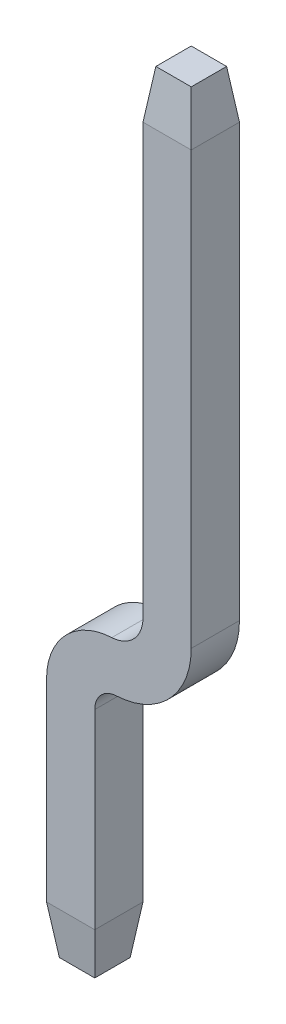
ISO-10303-21;
HEADER;
FILE_DESCRIPTION(('STEP AP214'),'2;1');
FILE_NAME('part.step','',(''),(''),'','','');
FILE_SCHEMA(('AUTOMOTIVE_DESIGN { 1 0 10303 214 1 1 1 1 }'));
ENDSEC;
DATA;
#1=APPLICATION_CONTEXT('core data for automotive mechanical design processes');
#2=APPLICATION_PROTOCOL_DEFINITION('international standard','automotive_design',2000,#1);
#3=PRODUCT_CONTEXT('',#1,'mechanical');
#4=PRODUCT('Part','Part','',(#3));
#5=PRODUCT_RELATED_PRODUCT_CATEGORY('part','',(#4));
#6=PRODUCT_DEFINITION_FORMATION('','',#4);
#7=PRODUCT_DEFINITION_CONTEXT('part definition',#1,'design');
#8=PRODUCT_DEFINITION('design','',#6,#7);
#9=PRODUCT_DEFINITION_SHAPE('','',#8);
#10=(LENGTH_UNIT() NAMED_UNIT(*) SI_UNIT(.MILLI.,.METRE.));
#11=(NAMED_UNIT(*) PLANE_ANGLE_UNIT() SI_UNIT($,.RADIAN.));
#12=(NAMED_UNIT(*) SI_UNIT($,.STERADIAN.) SOLID_ANGLE_UNIT());
#13=UNCERTAINTY_MEASURE_WITH_UNIT(LENGTH_MEASURE(1.E-05),#10,'distance_accuracy_value','');
#14=(GEOMETRIC_REPRESENTATION_CONTEXT(3) GLOBAL_UNCERTAINTY_ASSIGNED_CONTEXT((#13)) GLOBAL_UNIT_ASSIGNED_CONTEXT((#10,
#11,#12)) REPRESENTATION_CONTEXT('',''));
#15=CARTESIAN_POINT('',(0.,0.,0.));
#16=DIRECTION('',(0.,0.,1.));
#17=DIRECTION('',(1.,0.,0.));
#18=AXIS2_PLACEMENT_3D('',#15,#16,#17);
#19=CARTESIAN_POINT('',(0.,1.5,0.3));
#20=DIRECTION('',(1.,0.,0.));
#21=DIRECTION('',(0.,0.,-1.));
#22=AXIS2_PLACEMENT_3D('',#19,#20,#21);
#23=PLANE('',#22);
#24=DIRECTION('',(0.,-1.,0.));
#25=VECTOR('',#24,1.);
#26=CARTESIAN_POINT('',(0.,1.5,0.));
#27=LINE('',#26,#25);
#28=CARTESIAN_POINT('',(0.,1.5,0.));
#29=VERTEX_POINT('',#28);
#30=CARTESIAN_POINT('',(0.,0.3,0.));
#31=VERTEX_POINT('',#30);
#32=EDGE_CURVE('E10',#29,#31,#27,.T.);
#33=ORIENTED_EDGE('',*,*,#32,.T.);
#34=DIRECTION('',(0.,0.,-1.));
#35=VECTOR('',#34,1.);
#36=CARTESIAN_POINT('',(0.,0.3,0.3));
#37=LINE('',#36,#35);
#38=CARTESIAN_POINT('',(0.,0.3,0.3));
#39=VERTEX_POINT('',#38);
#40=EDGE_CURVE('E24',#39,#31,#37,.T.);
#41=ORIENTED_EDGE('',*,*,#40,.F.);
#42=DIRECTION('',(0.,-1.,0.));
#43=VECTOR('',#42,1.);
#44=CARTESIAN_POINT('',(0.,1.5,0.3));
#45=LINE('',#44,#43);
#46=CARTESIAN_POINT('',(0.,1.5,0.3));
#47=VERTEX_POINT('',#46);
#48=EDGE_CURVE('E306',#47,#39,#45,.T.);
#49=ORIENTED_EDGE('',*,*,#48,.F.);
#50=DIRECTION('',(0.,0.,-1.));
#51=VECTOR('',#50,1.);
#52=CARTESIAN_POINT('',(0.,1.5,0.3));
#53=LINE('',#52,#51);
#54=EDGE_CURVE('E302',#47,#29,#53,.T.);
#55=ORIENTED_EDGE('',*,*,#54,.T.);
#56=EDGE_LOOP('',(#33,#41,#49,#55));
#57=FACE_BOUND('',#56,.T.);
#58=ADVANCED_FACE('F16',(#57),#23,.F.);
#59=CARTESIAN_POINT('',(0.42700000000003,1.49999999999995,0.3));
#60=DIRECTION('',(0.,0.,-1.));
#61=DIRECTION('',(0.724268035012388,-0.689518537429774,0.));
#62=AXIS2_PLACEMENT_3D('',#59,#60,#61);
#63=CYLINDRICAL_SURFACE('',#62,0.42700000000003);
#64=CARTESIAN_POINT('',(0.42700000000003,1.49999999999995,0.));
#65=DIRECTION('',(0.,0.,1.));
#66=DIRECTION('',(1.,0.,0.));
#67=AXIS2_PLACEMENT_3D('',#64,#65,#66);
#68=CIRCLE('',#67,0.42700000000003);
#69=CARTESIAN_POINT('',(0.40602218437376,1.9264843857066,0.));
#70=VERTEX_POINT('',#69);
#71=EDGE_CURVE('E297',#70,#29,#68,.T.);
#72=ORIENTED_EDGE('',*,*,#71,.T.);
#73=ORIENTED_EDGE('',*,*,#54,.F.);
#74=CARTESIAN_POINT('',(0.42700000000003,1.49999999999995,0.3));
#75=DIRECTION('',(0.,0.,1.));
#76=DIRECTION('',(1.,0.,0.));
#77=AXIS2_PLACEMENT_3D('',#74,#75,#76);
#78=CIRCLE('',#77,0.42700000000003);
#79=CARTESIAN_POINT('',(0.40602218437376,1.9264843857066,0.3));
#80=VERTEX_POINT('',#79);
#81=EDGE_CURVE('E292',#80,#47,#78,.T.);
#82=ORIENTED_EDGE('',*,*,#81,.F.);
#83=DIRECTION('',(0.,0.,-1.));
#84=VECTOR('',#83,1.);
#85=CARTESIAN_POINT('',(0.40602218437376,1.9264843857066,0.3));
#86=LINE('',#85,#84);
#87=EDGE_CURVE('E288',#80,#70,#86,.T.);
#88=ORIENTED_EDGE('',*,*,#87,.T.);
#89=EDGE_LOOP('',(#72,#73,#82,#88));
#90=FACE_BOUND('',#89,.T.);
#91=ADVANCED_FACE('F324',(#90),#63,.T.);
#92=CARTESIAN_POINT('',(0.396000000000018,2.13023805026351,0.3));
#93=DIRECTION('',(0.,0.,-1.));
#94=DIRECTION('',(-0.724268028433877,0.68951854433982,0.));
#95=AXIS2_PLACEMENT_3D('',#92,#93,#94);
#96=CYLINDRICAL_SURFACE('',#95,0.203999999999982);
#97=CARTESIAN_POINT('',(0.396000000000018,2.13023805026351,0.));
#98=DIRECTION('',(0.,0.,1.));
#99=DIRECTION('',(1.,0.,0.));
#100=AXIS2_PLACEMENT_3D('',#97,#98,#99);
#101=CIRCLE('',#100,0.203999999999982);
#102=CARTESIAN_POINT('',(0.6,2.1302380502635,0.));
#103=VERTEX_POINT('',#102);
#104=EDGE_CURVE('E283',#70,#103,#101,.T.);
#105=ORIENTED_EDGE('',*,*,#104,.F.);
#106=ORIENTED_EDGE('',*,*,#87,.F.);
#107=CARTESIAN_POINT('',(0.396000000000018,2.13023805026351,0.3));
#108=DIRECTION('',(0.,0.,1.));
#109=DIRECTION('',(1.,0.,0.));
#110=AXIS2_PLACEMENT_3D('',#107,#108,#109);
#111=CIRCLE('',#110,0.203999999999982);
#112=CARTESIAN_POINT('',(0.6,2.1302380502635,0.3));
#113=VERTEX_POINT('',#112);
#114=EDGE_CURVE('E279',#80,#113,#111,.T.);
#115=ORIENTED_EDGE('',*,*,#114,.T.);
#116=DIRECTION('',(0.,0.,-1.));
#117=VECTOR('',#116,1.);
#118=CARTESIAN_POINT('',(0.6,2.1302380502635,0.3));
#119=LINE('',#118,#117);
#120=EDGE_CURVE('E275',#113,#103,#119,.T.);
#121=ORIENTED_EDGE('',*,*,#120,.T.);
#122=EDGE_LOOP('',(#105,#106,#115,#121));
#123=FACE_BOUND('',#122,.T.);
#124=ADVANCED_FACE('F371',(#123),#96,.F.);
#125=CARTESIAN_POINT('',(0.6,4.8,0.3));
#126=DIRECTION('',(1.,0.,0.));
#127=DIRECTION('',(0.,0.,-1.));
#128=AXIS2_PLACEMENT_3D('',#125,#126,#127);
#129=PLANE('',#128);
#130=DIRECTION('',(0.,-1.,0.));
#131=VECTOR('',#130,1.);
#132=CARTESIAN_POINT('',(0.6,4.8,0.));
#133=LINE('',#132,#131);
#134=CARTESIAN_POINT('',(0.6,4.8,0.));
#135=VERTEX_POINT('',#134);
#136=EDGE_CURVE('E270',#135,#103,#133,.T.);
#137=ORIENTED_EDGE('',*,*,#136,.T.);
#138=ORIENTED_EDGE('',*,*,#120,.F.);
#139=DIRECTION('',(0.,-1.,0.));
#140=VECTOR('',#139,1.);
#141=CARTESIAN_POINT('',(0.6,4.8,0.3));
#142=LINE('',#141,#140);
#143=CARTESIAN_POINT('',(0.6,4.8,0.3));
#144=VERTEX_POINT('',#143);
#145=EDGE_CURVE('E265',#144,#113,#142,.T.);
#146=ORIENTED_EDGE('',*,*,#145,.F.);
#147=DIRECTION('',(0.,0.,-1.));
#148=VECTOR('',#147,1.);
#149=CARTESIAN_POINT('',(0.6,4.8,0.3));
#150=LINE('',#149,#148);
#151=EDGE_CURVE('E261',#144,#135,#150,.T.);
#152=ORIENTED_EDGE('',*,*,#151,.T.);
#153=EDGE_LOOP('',(#137,#138,#146,#152));
#154=FACE_BOUND('',#153,.T.);
#155=ADVANCED_FACE('F357',(#154),#129,.F.);
#156=CARTESIAN_POINT('',(0.63997525542186,5.1,0.3));
#157=DIRECTION('',(0.991238608249016,-0.132083388495878,0.));
#158=DIRECTION('',(0.132083388495878,0.991238608249016,0.));
#159=AXIS2_PLACEMENT_3D('',#156,#157,#158);
#160=PLANE('',#159);
#161=ORIENTED_EDGE('',*,*,#151,.F.);
#162=DIRECTION('',(0.130946083317043,0.982703539490854,-0.130946083317042));
#163=VECTOR('',#162,1.);
#164=CARTESIAN_POINT('',(0.639289804644648,5.09485593697918,0.260710195355352));
#165=LINE('',#164,#163);
#166=CARTESIAN_POINT('',(0.63997525542186,5.1,0.26002474457814));
#167=VERTEX_POINT('',#166);
#168=EDGE_CURVE('E257',#144,#167,#165,.T.);
#169=ORIENTED_EDGE('',*,*,#168,.T.);
#170=DIRECTION('',(0.,0.,-1.));
#171=VECTOR('',#170,1.);
#172=CARTESIAN_POINT('',(0.63997525542186,5.1,0.3));
#173=LINE('',#172,#171);
#174=CARTESIAN_POINT('',(0.63997525542186,5.1,0.03997525542186));
#175=VERTEX_POINT('',#174);
#176=EDGE_CURVE('E253',#167,#175,#173,.T.);
#177=ORIENTED_EDGE('',*,*,#176,.T.);
#178=DIRECTION('',(-0.130946083317043,-0.982703539490854,-0.130946083317043));
#179=VECTOR('',#178,1.);
#180=CARTESIAN_POINT('',(0.64443386766547,5.13346029084661,0.0444338676654705));
#181=LINE('',#180,#179);
#182=EDGE_CURVE('E248',#175,#135,#181,.T.);
#183=ORIENTED_EDGE('',*,*,#182,.T.);
#184=EDGE_LOOP('',(#161,#169,#177,#183));
#185=FACE_BOUND('',#184,.T.);
#186=ADVANCED_FACE('F355',(#185),#160,.F.);
#187=CARTESIAN_POINT('',(0.9,4.8,0.));
#188=DIRECTION('',(0.,-0.132083388495878,0.991238608249016));
#189=DIRECTION('',(0.,-0.991238608249016,-0.132083388495878));
#190=AXIS2_PLACEMENT_3D('',#187,#188,#189);
#191=PLANE('',#190);
#192=DIRECTION('',(-1.,0.,0.));
#193=VECTOR('',#192,1.);
#194=CARTESIAN_POINT('',(0.9,4.8,0.));
#195=LINE('',#194,#193);
#196=CARTESIAN_POINT('',(0.9,4.8,0.));
#197=VERTEX_POINT('',#196);
#198=EDGE_CURVE('E243',#197,#135,#195,.T.);
#199=ORIENTED_EDGE('',*,*,#198,.T.);
#200=ORIENTED_EDGE('',*,*,#182,.F.);
#201=DIRECTION('',(-1.,0.,0.));
#202=VECTOR('',#201,1.);
#203=CARTESIAN_POINT('',(0.9,5.1,0.03997525542186));
#204=LINE('',#203,#202);
#205=CARTESIAN_POINT('',(0.86002474457814,5.1,0.03997525542186));
#206=VERTEX_POINT('',#205);
#207=EDGE_CURVE('E238',#206,#175,#204,.T.);
#208=ORIENTED_EDGE('',*,*,#207,.F.);
#209=DIRECTION('',(-0.130946083317043,0.982703539490854,0.130946083317043));
#210=VECTOR('',#209,1.);
#211=CARTESIAN_POINT('',(0.894855936979178,4.83860435386744,0.00514406302082213));
#212=LINE('',#211,#210);
#213=EDGE_CURVE('E233',#197,#206,#212,.T.);
#214=ORIENTED_EDGE('',*,*,#213,.F.);
#215=EDGE_LOOP('',(#199,#200,#208,#214));
#216=FACE_BOUND('',#215,.T.);
#217=ADVANCED_FACE('F369',(#216),#191,.F.);
#218=CARTESIAN_POINT('',(0.9,4.8,0.3));
#219=DIRECTION('',(-0.991238608249016,-0.132083388495878,0.));
#220=DIRECTION('',(0.132083388495878,-0.991238608249016,0.));
#221=AXIS2_PLACEMENT_3D('',#218,#219,#220);
#222=PLANE('',#221);
#223=DIRECTION('',(0.,0.,-1.));
#224=VECTOR('',#223,1.);
#225=CARTESIAN_POINT('',(0.86002474457814,5.1,0.3));
#226=LINE('',#225,#224);
#227=CARTESIAN_POINT('',(0.86002474457814,5.1,0.26002474457814));
#228=VERTEX_POINT('',#227);
#229=EDGE_CURVE('E228',#228,#206,#226,.T.);
#230=ORIENTED_EDGE('',*,*,#229,.F.);
#231=DIRECTION('',(0.130946083317043,-0.982703539490854,0.130946083317042));
#232=VECTOR('',#231,1.);
#233=CARTESIAN_POINT('',(0.9,4.8,0.3));
#234=LINE('',#233,#232);
#235=CARTESIAN_POINT('',(0.9,4.8,0.3));
#236=VERTEX_POINT('',#235);
#237=EDGE_CURVE('E224',#228,#236,#234,.T.);
#238=ORIENTED_EDGE('',*,*,#237,.T.);
#239=DIRECTION('',(0.,0.,-1.));
#240=VECTOR('',#239,1.);
#241=CARTESIAN_POINT('',(0.9,4.8,0.3));
#242=LINE('',#241,#240);
#243=EDGE_CURVE('E219',#236,#197,#242,.T.);
#244=ORIENTED_EDGE('',*,*,#243,.T.);
#245=ORIENTED_EDGE('',*,*,#213,.T.);
#246=EDGE_LOOP('',(#230,#238,#244,#245));
#247=FACE_BOUND('',#246,.T.);
#248=ADVANCED_FACE('F367',(#247),#222,.F.);
#249=CARTESIAN_POINT('',(0.9,2.1152853089021,0.3));
#250=DIRECTION('',(-1.,0.,0.));
#251=DIRECTION('',(0.,0.,1.));
#252=AXIS2_PLACEMENT_3D('',#249,#250,#251);
#253=PLANE('',#252);
#254=DIRECTION('',(0.,1.,0.));
#255=VECTOR('',#254,1.);
#256=CARTESIAN_POINT('',(0.9,2.1152853089021,0.));
#257=LINE('',#256,#255);
#258=CARTESIAN_POINT('',(0.9,2.1152853089021,0.));
#259=VERTEX_POINT('',#258);
#260=EDGE_CURVE('E214',#259,#197,#257,.T.);
#261=ORIENTED_EDGE('',*,*,#260,.T.);
#262=ORIENTED_EDGE('',*,*,#243,.F.);
#263=DIRECTION('',(0.,1.,0.));
#264=VECTOR('',#263,1.);
#265=CARTESIAN_POINT('',(0.9,2.1152853089021,0.3));
#266=LINE('',#265,#264);
#267=CARTESIAN_POINT('',(0.9,2.1152853089021,0.3));
#268=VERTEX_POINT('',#267);
#269=EDGE_CURVE('E209',#268,#236,#266,.T.);
#270=ORIENTED_EDGE('',*,*,#269,.F.);
#271=DIRECTION('',(0.,0.,-1.));
#272=VECTOR('',#271,1.);
#273=CARTESIAN_POINT('',(0.9,2.1152853089021,0.3));
#274=LINE('',#273,#272);
#275=EDGE_CURVE('E205',#268,#259,#274,.T.);
#276=ORIENTED_EDGE('',*,*,#275,.T.);
#277=EDGE_LOOP('',(#261,#262,#270,#276));
#278=FACE_BOUND('',#277,.T.);
#279=ADVANCED_FACE('F363',(#278),#253,.F.);
#280=CARTESIAN_POINT('',(0.410999999999953,2.11528530890213,0.3));
#281=DIRECTION('',(0.,0.,-1.));
#282=DIRECTION('',(-0.723746864455775,0.690065559342324,0.));
#283=AXIS2_PLACEMENT_3D('',#280,#281,#282);
#284=CYLINDRICAL_SURFACE('',#283,0.489000000000047);
#285=CARTESIAN_POINT('',(0.410999999999953,2.11528530890213,0.));
#286=DIRECTION('',(0.,0.,1.));
#287=DIRECTION('',(1.,0.,0.));
#288=AXIS2_PLACEMENT_3D('',#285,#286,#287);
#289=CIRCLE('',#288,0.489000000000047);
#290=CARTESIAN_POINT('',(0.43428571428571,1.6268400453257,0.));
#291=VERTEX_POINT('',#290);
#292=EDGE_CURVE('E200',#291,#259,#289,.T.);
#293=ORIENTED_EDGE('',*,*,#292,.T.);
#294=ORIENTED_EDGE('',*,*,#275,.F.);
#295=CARTESIAN_POINT('',(0.410999999999953,2.11528530890213,0.3));
#296=DIRECTION('',(0.,0.,1.));
#297=DIRECTION('',(1.,0.,0.));
#298=AXIS2_PLACEMENT_3D('',#295,#296,#297);
#299=CIRCLE('',#298,0.489000000000047);
#300=CARTESIAN_POINT('',(0.43428571428571,1.6268400453257,0.3));
#301=VERTEX_POINT('',#300);
#302=EDGE_CURVE('E195',#301,#268,#299,.T.);
#303=ORIENTED_EDGE('',*,*,#302,.F.);
#304=DIRECTION('',(0.,0.,-1.));
#305=VECTOR('',#304,1.);
#306=CARTESIAN_POINT('',(0.43428571428571,1.6268400453257,0.3));
#307=LINE('',#306,#305);
#308=EDGE_CURVE('E191',#301,#291,#307,.T.);
#309=ORIENTED_EDGE('',*,*,#308,.T.);
#310=EDGE_LOOP('',(#293,#294,#303,#309));
#311=FACE_BOUND('',#310,.T.);
#312=ADVANCED_FACE('F441',(#311),#284,.T.);
#313=CARTESIAN_POINT('',(0.440999999999939,1.48600000000005,0.3));
#314=DIRECTION('',(0.,0.,-1.));
#315=DIRECTION('',(0.723746864455742,-0.690065559342358,0.));
#316=AXIS2_PLACEMENT_3D('',#313,#314,#315);
#317=CYLINDRICAL_SURFACE('',#316,0.140999999999939);
#318=CARTESIAN_POINT('',(0.440999999999939,1.48600000000005,0.));
#319=DIRECTION('',(0.,0.,1.));
#320=DIRECTION('',(1.,0.,0.));
#321=AXIS2_PLACEMENT_3D('',#318,#319,#320);
#322=CIRCLE('',#321,0.140999999999939);
#323=CARTESIAN_POINT('',(0.3,1.486,0.));
#324=VERTEX_POINT('',#323);
#325=EDGE_CURVE('E186',#291,#324,#322,.T.);
#326=ORIENTED_EDGE('',*,*,#325,.F.);
#327=ORIENTED_EDGE('',*,*,#308,.F.);
#328=CARTESIAN_POINT('',(0.440999999999939,1.48600000000005,0.3));
#329=DIRECTION('',(0.,0.,1.));
#330=DIRECTION('',(1.,0.,0.));
#331=AXIS2_PLACEMENT_3D('',#328,#329,#330);
#332=CIRCLE('',#331,0.140999999999939);
#333=CARTESIAN_POINT('',(0.3,1.486,0.3));
#334=VERTEX_POINT('',#333);
#335=EDGE_CURVE('E182',#301,#334,#332,.T.);
#336=ORIENTED_EDGE('',*,*,#335,.T.);
#337=DIRECTION('',(0.,0.,-1.));
#338=VECTOR('',#337,1.);
#339=CARTESIAN_POINT('',(0.3,1.486,0.3));
#340=LINE('',#339,#338);
#341=EDGE_CURVE('E178',#334,#324,#340,.T.);
#342=ORIENTED_EDGE('',*,*,#341,.T.);
#343=EDGE_LOOP('',(#326,#327,#336,#342));
#344=FACE_BOUND('',#343,.T.);
#345=ADVANCED_FACE('F451',(#344),#317,.F.);
#346=CARTESIAN_POINT('',(0.3,0.3,0.3));
#347=DIRECTION('',(-1.,0.,0.));
#348=DIRECTION('',(0.,0.,1.));
#349=AXIS2_PLACEMENT_3D('',#346,#347,#348);
#350=PLANE('',#349);
#351=DIRECTION('',(0.,1.,0.));
#352=VECTOR('',#351,1.);
#353=CARTESIAN_POINT('',(0.3,0.3,0.));
#354=LINE('',#353,#352);
#355=CARTESIAN_POINT('',(0.3,0.3,0.));
#356=VERTEX_POINT('',#355);
#357=EDGE_CURVE('E173',#356,#324,#354,.T.);
#358=ORIENTED_EDGE('',*,*,#357,.T.);
#359=ORIENTED_EDGE('',*,*,#341,.F.);
#360=DIRECTION('',(0.,1.,0.));
#361=VECTOR('',#360,1.);
#362=CARTESIAN_POINT('',(0.3,0.3,0.3));
#363=LINE('',#362,#361);
#364=CARTESIAN_POINT('',(0.3,0.3,0.3));
#365=VERTEX_POINT('',#364);
#366=EDGE_CURVE('E168',#365,#334,#363,.T.);
#367=ORIENTED_EDGE('',*,*,#366,.F.);
#368=DIRECTION('',(0.,0.,-1.));
#369=VECTOR('',#368,1.);
#370=CARTESIAN_POINT('',(0.3,0.3,0.3));
#371=LINE('',#370,#369);
#372=EDGE_CURVE('E164',#365,#356,#371,.T.);
#373=ORIENTED_EDGE('',*,*,#372,.T.);
#374=EDGE_LOOP('',(#358,#359,#367,#373));
#375=FACE_BOUND('',#374,.T.);
#376=ADVANCED_FACE('F462',(#375),#350,.F.);
#377=CARTESIAN_POINT('',(0.26002474457814,0.,0.3));
#378=DIRECTION('',(-0.991238608249016,0.132083388495878,0.));
#379=DIRECTION('',(-0.132083388495878,-0.991238608249016,0.));
#380=AXIS2_PLACEMENT_3D('',#377,#378,#379);
#381=PLANE('',#380);
#382=DIRECTION('',(0.,0.,-1.));
#383=VECTOR('',#382,1.);
#384=CARTESIAN_POINT('',(0.26002474457814,0.,0.3));
#385=LINE('',#384,#383);
#386=CARTESIAN_POINT('',(0.26002474457814,0.,0.26002474457814));
#387=VERTEX_POINT('',#386);
#388=CARTESIAN_POINT('',(0.26002474457814,0.,0.03997525542186));
#389=VERTEX_POINT('',#388);
#390=EDGE_CURVE('E160',#387,#389,#385,.T.);
#391=ORIENTED_EDGE('',*,*,#390,.T.);
#392=DIRECTION('',(0.130946083317042,0.982703539490854,-0.130946083317043));
#393=VECTOR('',#392,1.);
#394=CARTESIAN_POINT('',(0.25556613233453,-0.0334602908466144,0.0444338676654705));
#395=LINE('',#394,#393);
#396=EDGE_CURVE('E128',#389,#356,#395,.T.);
#397=ORIENTED_EDGE('',*,*,#396,.T.);
#398=ORIENTED_EDGE('',*,*,#372,.F.);
#399=DIRECTION('',(-0.130946083317042,-0.982703539490854,-0.130946083317042));
#400=VECTOR('',#399,1.);
#401=CARTESIAN_POINT('',(0.260710195355352,0.00514406302082215,0.260710195355352));
#402=LINE('',#401,#400);
#403=EDGE_CURVE('E153',#365,#387,#402,.T.);
#404=ORIENTED_EDGE('',*,*,#403,.T.);
#405=EDGE_LOOP('',(#391,#397,#398,#404));
#406=FACE_BOUND('',#405,.T.);
#407=ADVANCED_FACE('F473',(#406),#381,.F.);
#408=CARTESIAN_POINT('',(0.9,0.3,0.3));
#409=DIRECTION('',(0.,0.132083388495878,-0.991238608249017));
#410=DIRECTION('',(0.,0.991238608249017,0.132083388495878));
#411=AXIS2_PLACEMENT_3D('',#408,#409,#410);
#412=PLANE('',#411);
#413=DIRECTION('',(-1.,0.,0.));
#414=VECTOR('',#413,1.);
#415=CARTESIAN_POINT('',(0.9,0.,0.26002474457814));
#416=LINE('',#415,#414);
#417=CARTESIAN_POINT('',(0.03997525542186,0.,0.26002474457814));
#418=VERTEX_POINT('',#417);
#419=EDGE_CURVE('E135',#387,#418,#416,.T.);
#420=ORIENTED_EDGE('',*,*,#419,.F.);
#421=ORIENTED_EDGE('',*,*,#403,.F.);
#422=DIRECTION('',(-1.,0.,0.));
#423=VECTOR('',#422,1.);
#424=CARTESIAN_POINT('',(0.9,0.3,0.3));
#425=LINE('',#424,#423);
#426=EDGE_CURVE('E145',#365,#39,#425,.T.);
#427=ORIENTED_EDGE('',*,*,#426,.T.);
#428=DIRECTION('',(-0.130946083317043,0.982703539490854,0.130946083317042));
#429=VECTOR('',#428,1.);
#430=CARTESIAN_POINT('',(0.,0.3,0.3));
#431=LINE('',#430,#429);
#432=EDGE_CURVE('E121',#418,#39,#431,.T.);
#433=ORIENTED_EDGE('',*,*,#432,.F.);
#434=EDGE_LOOP('',(#420,#421,#427,#433));
#435=FACE_BOUND('',#434,.T.);
#436=ADVANCED_FACE('F484',(#435),#412,.F.);
#437=CARTESIAN_POINT('',(0.,0.3,0.3));
#438=DIRECTION('',(0.991238608249016,0.132083388495878,0.));
#439=DIRECTION('',(-0.132083388495878,0.991238608249016,0.));
#440=AXIS2_PLACEMENT_3D('',#437,#438,#439);
#441=PLANE('',#440);
#442=ORIENTED_EDGE('',*,*,#40,.T.);
#443=DIRECTION('',(0.130946083317043,-0.982703539490854,0.130946083317043));
#444=VECTOR('',#443,1.);
#445=CARTESIAN_POINT('',(0.00514406302082216,0.261395646132563,0.00514406302082218));
#446=LINE('',#445,#444);
#447=CARTESIAN_POINT('',(0.03997525542186,0.,0.03997525542186));
#448=VERTEX_POINT('',#447);
#449=EDGE_CURVE('E113',#31,#448,#446,.T.);
#450=ORIENTED_EDGE('',*,*,#449,.T.);
#451=DIRECTION('',(0.,0.,-1.));
#452=VECTOR('',#451,1.);
#453=CARTESIAN_POINT('',(0.03997525542186,0.,0.3));
#454=LINE('',#453,#452);
#455=EDGE_CURVE('E117',#418,#448,#454,.T.);
#456=ORIENTED_EDGE('',*,*,#455,.F.);
#457=ORIENTED_EDGE('',*,*,#432,.T.);
#458=EDGE_LOOP('',(#442,#450,#456,#457));
#459=FACE_BOUND('',#458,.T.);
#460=ADVANCED_FACE('F115',(#459),#441,.F.);
#461=CARTESIAN_POINT('',(0.03997525542186,0.,0.3));
#462=DIRECTION('',(0.,1.,0.));
#463=DIRECTION('',(0.,0.,1.));
#464=AXIS2_PLACEMENT_3D('',#461,#462,#463);
#465=PLANE('',#464);
#466=ORIENTED_EDGE('',*,*,#455,.T.);
#467=DIRECTION('',(-1.,0.,0.));
#468=VECTOR('',#467,1.);
#469=CARTESIAN_POINT('',(0.9,0.,0.03997525542186));
#470=LINE('',#469,#468);
#471=EDGE_CURVE('E125',#389,#448,#470,.T.);
#472=ORIENTED_EDGE('',*,*,#471,.F.);
#473=ORIENTED_EDGE('',*,*,#390,.F.);
#474=ORIENTED_EDGE('',*,*,#419,.T.);
#475=EDGE_LOOP('',(#466,#472,#473,#474));
#476=FACE_BOUND('',#475,.T.);
#477=ADVANCED_FACE('F133',(#476),#465,.F.);
#478=CARTESIAN_POINT('',(0.9,0.,0.03997525542186));
#479=DIRECTION('',(0.,0.132083388495878,0.991238608249016));
#480=DIRECTION('',(0.,-0.991238608249016,0.132083388495878));
#481=AXIS2_PLACEMENT_3D('',#478,#479,#480);
#482=PLANE('',#481);
#483=DIRECTION('',(-1.,0.,0.));
#484=VECTOR('',#483,1.);
#485=CARTESIAN_POINT('',(0.9,0.3,0.));
#486=LINE('',#485,#484);
#487=EDGE_CURVE('E131',#356,#31,#486,.T.);
#488=ORIENTED_EDGE('',*,*,#487,.F.);
#489=ORIENTED_EDGE('',*,*,#396,.F.);
#490=ORIENTED_EDGE('',*,*,#471,.T.);
#491=ORIENTED_EDGE('',*,*,#449,.F.);
#492=EDGE_LOOP('',(#488,#489,#490,#491));
#493=FACE_BOUND('',#492,.T.);
#494=ADVANCED_FACE('F126',(#493),#482,.F.);
#495=CARTESIAN_POINT('',(0.440999999999939,1.48600000000005,0.));
#496=DIRECTION('',(0.,0.,1.));
#497=DIRECTION('',(1.,0.,0.));
#498=AXIS2_PLACEMENT_3D('',#495,#496,#497);
#499=PLANE('',#498);
#500=ORIENTED_EDGE('',*,*,#136,.F.);
#501=ORIENTED_EDGE('',*,*,#198,.F.);
#502=ORIENTED_EDGE('',*,*,#260,.F.);
#503=ORIENTED_EDGE('',*,*,#292,.F.);
#504=ORIENTED_EDGE('',*,*,#325,.T.);
#505=ORIENTED_EDGE('',*,*,#357,.F.);
#506=ORIENTED_EDGE('',*,*,#487,.T.);
#507=ORIENTED_EDGE('',*,*,#32,.F.);
#508=ORIENTED_EDGE('',*,*,#71,.F.);
#509=ORIENTED_EDGE('',*,*,#104,.T.);
#510=EDGE_LOOP('',(#500,#501,#502,#503,#504,#505,#506,#507,#508,#509));
#511=FACE_BOUND('',#510,.T.);
#512=ADVANCED_FACE('F329',(#511),#499,.F.);
#513=CARTESIAN_POINT('',(0.440999999999939,1.48600000000005,0.3));
#514=DIRECTION('',(0.,0.,1.));
#515=DIRECTION('',(1.,0.,0.));
#516=AXIS2_PLACEMENT_3D('',#513,#514,#515);
#517=PLANE('',#516);
#518=DIRECTION('',(-1.,0.,0.));
#519=VECTOR('',#518,1.);
#520=CARTESIAN_POINT('',(0.9,4.8,0.3));
#521=LINE('',#520,#519);
#522=EDGE_CURVE('E331',#236,#144,#521,.T.);
#523=ORIENTED_EDGE('',*,*,#522,.T.);
#524=ORIENTED_EDGE('',*,*,#145,.T.);
#525=ORIENTED_EDGE('',*,*,#114,.F.);
#526=ORIENTED_EDGE('',*,*,#81,.T.);
#527=ORIENTED_EDGE('',*,*,#48,.T.);
#528=ORIENTED_EDGE('',*,*,#426,.F.);
#529=ORIENTED_EDGE('',*,*,#366,.T.);
#530=ORIENTED_EDGE('',*,*,#335,.F.);
#531=ORIENTED_EDGE('',*,*,#302,.T.);
#532=ORIENTED_EDGE('',*,*,#269,.T.);
#533=EDGE_LOOP('',(#523,#524,#525,#526,#527,#528,#529,#530,#531,#532));
#534=FACE_BOUND('',#533,.T.);
#535=ADVANCED_FACE('F318',(#534),#517,.T.);
#536=CARTESIAN_POINT('',(0.9,5.1,0.26002474457814));
#537=DIRECTION('',(0.,-0.132083388495878,-0.991238608249016));
#538=DIRECTION('',(0.,0.991238608249016,-0.132083388495878));
#539=AXIS2_PLACEMENT_3D('',#536,#537,#538);
#540=PLANE('',#539);
#541=DIRECTION('',(-1.,0.,0.));
#542=VECTOR('',#541,1.);
#543=CARTESIAN_POINT('',(0.9,5.1,0.26002474457814));
#544=LINE('',#543,#542);
#545=EDGE_CURVE('E333',#228,#167,#544,.T.);
#546=ORIENTED_EDGE('',*,*,#545,.T.);
#547=ORIENTED_EDGE('',*,*,#168,.F.);
#548=ORIENTED_EDGE('',*,*,#522,.F.);
#549=ORIENTED_EDGE('',*,*,#237,.F.);
#550=EDGE_LOOP('',(#546,#547,#548,#549));
#551=FACE_BOUND('',#550,.T.);
#552=ADVANCED_FACE('F348',(#551),#540,.F.);
#553=CARTESIAN_POINT('',(0.86002474457814,5.1,0.3));
#554=DIRECTION('',(0.,-1.,0.));
#555=DIRECTION('',(0.,0.,-1.));
#556=AXIS2_PLACEMENT_3D('',#553,#554,#555);
#557=PLANE('',#556);
#558=ORIENTED_EDGE('',*,*,#176,.F.);
#559=ORIENTED_EDGE('',*,*,#545,.F.);
#560=ORIENTED_EDGE('',*,*,#229,.T.);
#561=ORIENTED_EDGE('',*,*,#207,.T.);
#562=EDGE_LOOP('',(#558,#559,#560,#561));
#563=FACE_BOUND('',#562,.T.);
#564=ADVANCED_FACE('F352',(#563),#557,.F.);
#565=CLOSED_SHELL('',(#58,#91,#124,#155,#186,#217,#248,#279,#312,#345,#376,#407,#436,#460,#477,
#494,#512,#535,#552,#564));
#566=MANIFOLD_SOLID_BREP('B1',#565);
#567=ADVANCED_BREP_SHAPE_REPRESENTATION('',(#18,#566),#14);
#568=SHAPE_DEFINITION_REPRESENTATION(#9,#567);
ENDSEC;
END-ISO-10303-21;
